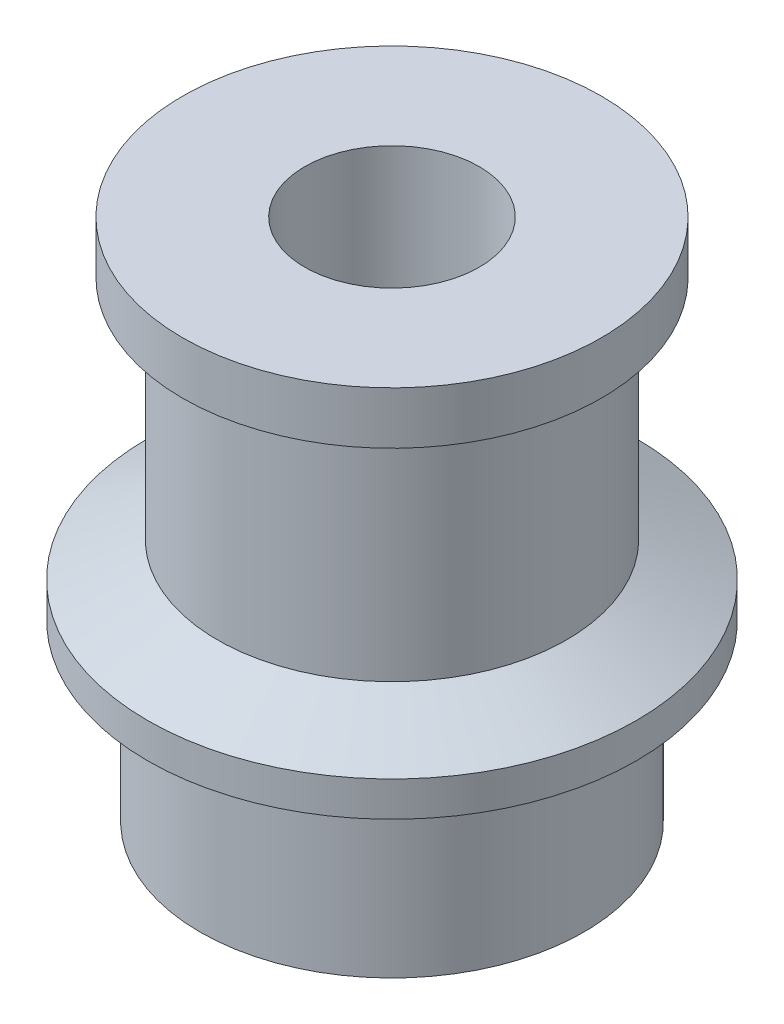
ISO-10303-21;
HEADER;
FILE_DESCRIPTION(('STEP AP214'),'2;1');
FILE_NAME('part.step','',(''),(''),'','','');
FILE_SCHEMA(('AUTOMOTIVE_DESIGN { 1 0 10303 214 1 1 1 1 }'));
ENDSEC;
DATA;
#1=APPLICATION_CONTEXT('core data for automotive mechanical design processes');
#2=APPLICATION_PROTOCOL_DEFINITION('international standard','automotive_design',2000,#1);
#3=PRODUCT_CONTEXT('',#1,'mechanical');
#4=PRODUCT('Part','Part','',(#3));
#5=PRODUCT_RELATED_PRODUCT_CATEGORY('part','',(#4));
#6=PRODUCT_DEFINITION_FORMATION('','',#4);
#7=PRODUCT_DEFINITION_CONTEXT('part definition',#1,'design');
#8=PRODUCT_DEFINITION('design','',#6,#7);
#9=PRODUCT_DEFINITION_SHAPE('','',#8);
#10=(LENGTH_UNIT() NAMED_UNIT(*) SI_UNIT(.MILLI.,.METRE.));
#11=(NAMED_UNIT(*) PLANE_ANGLE_UNIT() SI_UNIT($,.RADIAN.));
#12=(NAMED_UNIT(*) SI_UNIT($,.STERADIAN.) SOLID_ANGLE_UNIT());
#13=UNCERTAINTY_MEASURE_WITH_UNIT(LENGTH_MEASURE(1.E-05),#10,'distance_accuracy_value','');
#14=(GEOMETRIC_REPRESENTATION_CONTEXT(3) GLOBAL_UNCERTAINTY_ASSIGNED_CONTEXT((#13)) GLOBAL_UNIT_ASSIGNED_CONTEXT((#10,
#11,#12)) REPRESENTATION_CONTEXT('',''));
#15=CARTESIAN_POINT('',(0.,0.,0.));
#16=DIRECTION('',(0.,0.,1.));
#17=DIRECTION('',(1.,0.,0.));
#18=AXIS2_PLACEMENT_3D('',#15,#16,#17);
#19=CARTESIAN_POINT('',(0.,14.,0.));
#20=DIRECTION('',(0.,-1.,0.));
#21=DIRECTION('',(0.,0.,-1.));
#22=AXIS2_PLACEMENT_3D('',#19,#20,#21);
#23=PLANE('',#22);
#24=CARTESIAN_POINT('',(0.,14.,0.));
#25=DIRECTION('',(0.,-1.,0.));
#26=DIRECTION('',(0.,0.,-1.));
#27=AXIS2_PLACEMENT_3D('',#24,#25,#26);
#28=CIRCLE('',#27,5.);
#29=CARTESIAN_POINT('',(0.,14.,-5.));
#30=VERTEX_POINT('',#29);
#31=EDGE_CURVE('E10',#30,#30,#28,.T.);
#32=ORIENTED_EDGE('',*,*,#31,.F.);
#33=EDGE_LOOP('',(#32));
#34=FACE_BOUND('',#33,.T.);
#35=ADVANCED_FACE('F30',(#34),#23,.F.);
#36=CARTESIAN_POINT('',(0.,0.,0.));
#37=DIRECTION('',(0.,-1.,0.));
#38=DIRECTION('',(0.,0.,-1.));
#39=AXIS2_PLACEMENT_3D('',#36,#37,#38);
#40=CYLINDRICAL_SURFACE('',#39,5.);
#41=CARTESIAN_POINT('',(0.,30.,0.));
#42=DIRECTION('',(0.,-1.,0.));
#43=DIRECTION('',(0.,0.,-1.));
#44=AXIS2_PLACEMENT_3D('',#41,#42,#43);
#45=CIRCLE('',#44,5.);
#46=CARTESIAN_POINT('',(0.,30.,-5.));
#47=VERTEX_POINT('',#46);
#48=EDGE_CURVE('E36',#47,#47,#45,.T.);
#49=ORIENTED_EDGE('',*,*,#48,.F.);
#50=EDGE_LOOP('',(#49));
#51=FACE_BOUND('',#50,.T.);
#52=ORIENTED_EDGE('',*,*,#31,.T.);
#53=EDGE_LOOP('',(#52));
#54=FACE_BOUND('',#53,.T.);
#55=ADVANCED_FACE('F114',(#51,#54),#40,.F.);
#56=CARTESIAN_POINT('',(-5.,30.,0.));
#57=DIRECTION('',(0.,-1.,0.));
#58=DIRECTION('',(0.,0.,-1.));
#59=AXIS2_PLACEMENT_3D('',#56,#57,#58);
#60=PLANE('',#59);
#61=CARTESIAN_POINT('',(0.,30.,0.));
#62=DIRECTION('',(0.,-1.,0.));
#63=DIRECTION('',(0.,0.,-1.));
#64=AXIS2_PLACEMENT_3D('',#61,#62,#63);
#65=CIRCLE('',#64,12.);
#66=CARTESIAN_POINT('',(0.,30.,-12.));
#67=VERTEX_POINT('',#66);
#68=EDGE_CURVE('E40',#67,#67,#65,.T.);
#69=ORIENTED_EDGE('',*,*,#68,.F.);
#70=EDGE_LOOP('',(#69));
#71=FACE_BOUND('',#70,.T.);
#72=ORIENTED_EDGE('',*,*,#48,.T.);
#73=EDGE_LOOP('',(#72));
#74=FACE_BOUND('',#73,.T.);
#75=ADVANCED_FACE('F109',(#71,#74),#60,.F.);
#76=CARTESIAN_POINT('',(0.,0.,0.));
#77=DIRECTION('',(0.,-1.,0.));
#78=DIRECTION('',(0.,0.,-1.));
#79=AXIS2_PLACEMENT_3D('',#76,#77,#78);
#80=CYLINDRICAL_SURFACE('',#79,12.);
#81=CARTESIAN_POINT('',(0.,27.,0.));
#82=DIRECTION('',(0.,-1.,0.));
#83=DIRECTION('',(0.,0.,-1.));
#84=AXIS2_PLACEMENT_3D('',#81,#82,#83);
#85=CIRCLE('',#84,12.);
#86=CARTESIAN_POINT('',(0.,27.,-12.));
#87=VERTEX_POINT('',#86);
#88=EDGE_CURVE('E44',#87,#87,#85,.T.);
#89=ORIENTED_EDGE('',*,*,#88,.F.);
#90=EDGE_LOOP('',(#89));
#91=FACE_BOUND('',#90,.T.);
#92=ORIENTED_EDGE('',*,*,#68,.T.);
#93=EDGE_LOOP('',(#92));
#94=FACE_BOUND('',#93,.T.);
#95=ADVANCED_FACE('F103',(#91,#94),#80,.T.);
#96=CARTESIAN_POINT('',(-12.,27.,0.));
#97=DIRECTION('',(0.,1.,0.));
#98=DIRECTION('',(0.,0.,1.));
#99=AXIS2_PLACEMENT_3D('',#96,#97,#98);
#100=PLANE('',#99);
#101=CARTESIAN_POINT('',(0.,27.,0.));
#102=DIRECTION('',(0.,-1.,0.));
#103=DIRECTION('',(0.,0.,-1.));
#104=AXIS2_PLACEMENT_3D('',#101,#102,#103);
#105=CIRCLE('',#104,10.);
#106=CARTESIAN_POINT('',(0.,27.,-10.));
#107=VERTEX_POINT('',#106);
#108=EDGE_CURVE('E49',#107,#107,#105,.T.);
#109=ORIENTED_EDGE('',*,*,#108,.F.);
#110=EDGE_LOOP('',(#109));
#111=FACE_BOUND('',#110,.T.);
#112=ORIENTED_EDGE('',*,*,#88,.T.);
#113=EDGE_LOOP('',(#112));
#114=FACE_BOUND('',#113,.T.);
#115=ADVANCED_FACE('F97',(#111,#114),#100,.F.);
#116=CARTESIAN_POINT('',(0.,0.,0.));
#117=DIRECTION('',(0.,-1.,0.));
#118=DIRECTION('',(0.,0.,-1.));
#119=AXIS2_PLACEMENT_3D('',#116,#117,#118);
#120=CYLINDRICAL_SURFACE('',#119,10.);
#121=CARTESIAN_POINT('',(0.,14.,0.));
#122=DIRECTION('',(0.,-1.,0.));
#123=DIRECTION('',(0.,0.,-1.));
#124=AXIS2_PLACEMENT_3D('',#121,#122,#123);
#125=CIRCLE('',#124,10.);
#126=CARTESIAN_POINT('',(0.,14.,-10.));
#127=VERTEX_POINT('',#126);
#128=EDGE_CURVE('E52',#127,#127,#125,.T.);
#129=ORIENTED_EDGE('',*,*,#128,.F.);
#130=EDGE_LOOP('',(#129));
#131=FACE_BOUND('',#130,.T.);
#132=ORIENTED_EDGE('',*,*,#108,.T.);
#133=EDGE_LOOP('',(#132));
#134=FACE_BOUND('',#133,.T.);
#135=ADVANCED_FACE('F91',(#131,#134),#120,.T.);
#136=CARTESIAN_POINT('',(0.,14.,0.));
#137=DIRECTION('',(0.,-1.,0.));
#138=DIRECTION('',(0.,0.,-1.));
#139=AXIS2_PLACEMENT_3D('',#136,#137,#138);
#140=CONICAL_SURFACE('',#139,10.,1.10714871779409);
#141=CARTESIAN_POINT('',(0.,12.,0.));
#142=DIRECTION('',(0.,-1.,0.));
#143=DIRECTION('',(0.,0.,-1.));
#144=AXIS2_PLACEMENT_3D('',#141,#142,#143);
#145=CIRCLE('',#144,14.);
#146=CARTESIAN_POINT('',(0.,12.,-14.));
#147=VERTEX_POINT('',#146);
#148=EDGE_CURVE('E55',#147,#147,#145,.T.);
#149=ORIENTED_EDGE('',*,*,#148,.F.);
#150=EDGE_LOOP('',(#149));
#151=FACE_BOUND('',#150,.T.);
#152=ORIENTED_EDGE('',*,*,#128,.T.);
#153=EDGE_LOOP('',(#152));
#154=FACE_BOUND('',#153,.T.);
#155=ADVANCED_FACE('F85',(#151,#154),#140,.T.);
#156=CARTESIAN_POINT('',(0.,0.,0.));
#157=DIRECTION('',(0.,-1.,0.));
#158=DIRECTION('',(0.,0.,-1.));
#159=AXIS2_PLACEMENT_3D('',#156,#157,#158);
#160=CYLINDRICAL_SURFACE('',#159,14.);
#161=CARTESIAN_POINT('',(0.,10.,0.));
#162=DIRECTION('',(0.,-1.,0.));
#163=DIRECTION('',(0.,0.,-1.));
#164=AXIS2_PLACEMENT_3D('',#161,#162,#163);
#165=CIRCLE('',#164,14.);
#166=CARTESIAN_POINT('',(0.,10.,-14.));
#167=VERTEX_POINT('',#166);
#168=EDGE_CURVE('E58',#167,#167,#165,.T.);
#169=ORIENTED_EDGE('',*,*,#168,.F.);
#170=EDGE_LOOP('',(#169));
#171=FACE_BOUND('',#170,.T.);
#172=ORIENTED_EDGE('',*,*,#148,.T.);
#173=EDGE_LOOP('',(#172));
#174=FACE_BOUND('',#173,.T.);
#175=ADVANCED_FACE('F79',(#171,#174),#160,.T.);
#176=CARTESIAN_POINT('',(-14.,10.,0.));
#177=DIRECTION('',(0.,1.,0.));
#178=DIRECTION('',(0.,0.,1.));
#179=AXIS2_PLACEMENT_3D('',#176,#177,#178);
#180=PLANE('',#179);
#181=CARTESIAN_POINT('',(0.,10.,0.));
#182=DIRECTION('',(0.,-1.,0.));
#183=DIRECTION('',(0.,0.,-1.));
#184=AXIS2_PLACEMENT_3D('',#181,#182,#183);
#185=CIRCLE('',#184,11.);
#186=CARTESIAN_POINT('',(0.,10.,-11.));
#187=VERTEX_POINT('',#186);
#188=EDGE_CURVE('E61',#187,#187,#185,.T.);
#189=ORIENTED_EDGE('',*,*,#188,.F.);
#190=EDGE_LOOP('',(#189));
#191=FACE_BOUND('',#190,.T.);
#192=ORIENTED_EDGE('',*,*,#168,.T.);
#193=EDGE_LOOP('',(#192));
#194=FACE_BOUND('',#193,.T.);
#195=ADVANCED_FACE('F73',(#191,#194),#180,.F.);
#196=CARTESIAN_POINT('',(0.,0.,0.));
#197=DIRECTION('',(0.,-1.,0.));
#198=DIRECTION('',(0.,0.,-1.));
#199=AXIS2_PLACEMENT_3D('',#196,#197,#198);
#200=CYLINDRICAL_SURFACE('',#199,11.);
#201=CARTESIAN_POINT('',(0.,0.,0.));
#202=DIRECTION('',(0.,-1.,0.));
#203=DIRECTION('',(0.,0.,-1.));
#204=AXIS2_PLACEMENT_3D('',#201,#202,#203);
#205=CIRCLE('',#204,11.);
#206=CARTESIAN_POINT('',(0.,0.,-11.));
#207=VERTEX_POINT('',#206);
#208=EDGE_CURVE('E64',#207,#207,#205,.T.);
#209=ORIENTED_EDGE('',*,*,#208,.F.);
#210=EDGE_LOOP('',(#209));
#211=FACE_BOUND('',#210,.T.);
#212=ORIENTED_EDGE('',*,*,#188,.T.);
#213=EDGE_LOOP('',(#212));
#214=FACE_BOUND('',#213,.T.);
#215=ADVANCED_FACE('F70',(#211,#214),#200,.T.);
#216=CARTESIAN_POINT('',(-11.,0.,0.));
#217=DIRECTION('',(0.,1.,0.));
#218=DIRECTION('',(0.,0.,1.));
#219=AXIS2_PLACEMENT_3D('',#216,#217,#218);
#220=PLANE('',#219);
#221=ORIENTED_EDGE('',*,*,#208,.T.);
#222=EDGE_LOOP('',(#221));
#223=FACE_BOUND('',#222,.T.);
#224=ADVANCED_FACE('F68',(#223),#220,.F.);
#225=CLOSED_SHELL('',(#35,#55,#75,#95,#115,#135,#155,#175,#195,#215,#224));
#226=MANIFOLD_SOLID_BREP('B2',#225);
#227=ADVANCED_BREP_SHAPE_REPRESENTATION('',(#18,#226),#14);
#228=SHAPE_DEFINITION_REPRESENTATION(#9,#227);
ENDSEC;
END-ISO-10303-21;
